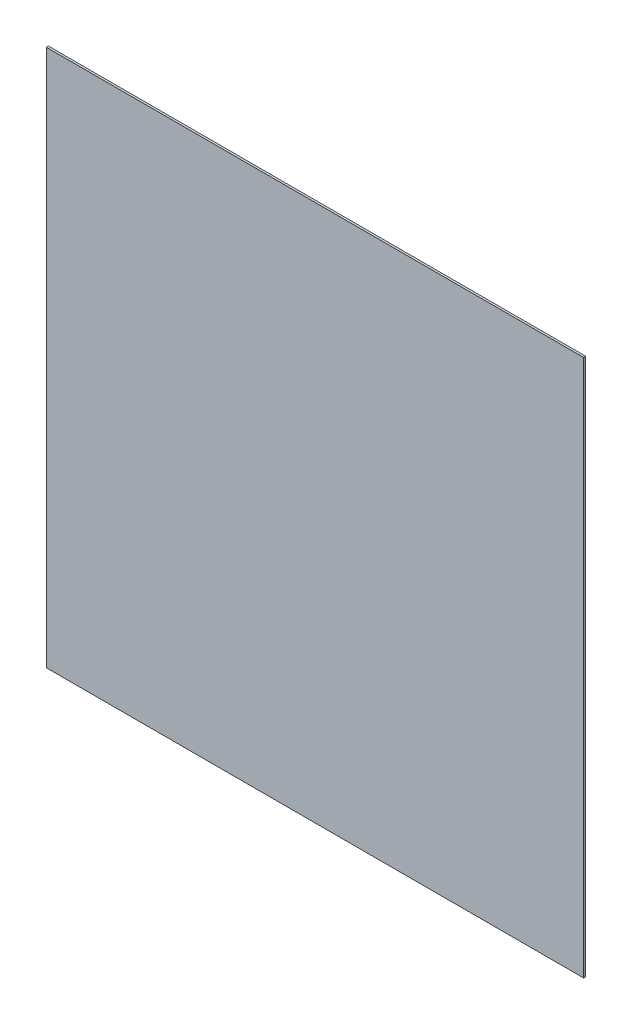
ISO-10303-21;
HEADER;
FILE_DESCRIPTION(('STEP AP214'),'2;1');
FILE_NAME('part.step','',(''),(''),'','','');
FILE_SCHEMA(('AUTOMOTIVE_DESIGN { 1 0 10303 214 1 1 1 1 }'));
ENDSEC;
DATA;
#1=APPLICATION_CONTEXT('core data for automotive mechanical design processes');
#2=APPLICATION_PROTOCOL_DEFINITION('international standard','automotive_design',2000,#1);
#3=PRODUCT_CONTEXT('',#1,'mechanical');
#4=PRODUCT('Part','Part','',(#3));
#5=PRODUCT_RELATED_PRODUCT_CATEGORY('part','',(#4));
#6=PRODUCT_DEFINITION_FORMATION('','',#4);
#7=PRODUCT_DEFINITION_CONTEXT('part definition',#1,'design');
#8=PRODUCT_DEFINITION('design','',#6,#7);
#9=PRODUCT_DEFINITION_SHAPE('','',#8);
#10=(LENGTH_UNIT() NAMED_UNIT(*) SI_UNIT(.MILLI.,.METRE.));
#11=(NAMED_UNIT(*) PLANE_ANGLE_UNIT() SI_UNIT($,.RADIAN.));
#12=(NAMED_UNIT(*) SI_UNIT($,.STERADIAN.) SOLID_ANGLE_UNIT());
#13=UNCERTAINTY_MEASURE_WITH_UNIT(LENGTH_MEASURE(1.E-05),#10,'distance_accuracy_value','');
#14=(GEOMETRIC_REPRESENTATION_CONTEXT(3) GLOBAL_UNCERTAINTY_ASSIGNED_CONTEXT((#13)) GLOBAL_UNIT_ASSIGNED_CONTEXT((#10,
#11,#12)) REPRESENTATION_CONTEXT('',''));
#15=CARTESIAN_POINT('',(0.,0.,0.));
#16=DIRECTION('',(0.,0.,1.));
#17=DIRECTION('',(1.,0.,0.));
#18=AXIS2_PLACEMENT_3D('',#15,#16,#17);
#19=CARTESIAN_POINT('',(25.4,125.4,0.39116));
#20=DIRECTION('',(1.,0.,0.));
#21=DIRECTION('',(0.,0.,-1.));
#22=AXIS2_PLACEMENT_3D('',#19,#20,#21);
#23=PLANE('',#22);
#24=DIRECTION('',(0.,-1.,0.));
#25=VECTOR('',#24,1.);
#26=CARTESIAN_POINT('',(25.4,125.4,0.));
#27=LINE('',#26,#25);
#28=CARTESIAN_POINT('',(25.4,125.4,0.));
#29=VERTEX_POINT('',#28);
#30=CARTESIAN_POINT('',(25.4,25.4,0.));
#31=VERTEX_POINT('',#30);
#32=EDGE_CURVE('E100',#29,#31,#27,.T.);
#33=ORIENTED_EDGE('',*,*,#32,.T.);
#34=DIRECTION('',(0.,0.,-1.));
#35=VECTOR('',#34,1.);
#36=CARTESIAN_POINT('',(25.4,25.4,0.39116));
#37=LINE('',#36,#35);
#38=CARTESIAN_POINT('',(25.4,25.4,0.39116));
#39=VERTEX_POINT('',#38);
#40=EDGE_CURVE('E11',#39,#31,#37,.T.);
#41=ORIENTED_EDGE('',*,*,#40,.F.);
#42=DIRECTION('',(0.,-1.,0.));
#43=VECTOR('',#42,1.);
#44=CARTESIAN_POINT('',(25.4,125.4,0.39116));
#45=LINE('',#44,#43);
#46=CARTESIAN_POINT('',(25.4,125.4,0.39116));
#47=VERTEX_POINT('',#46);
#48=EDGE_CURVE('E88',#47,#39,#45,.T.);
#49=ORIENTED_EDGE('',*,*,#48,.F.);
#50=DIRECTION('',(0.,0.,-1.));
#51=VECTOR('',#50,1.);
#52=CARTESIAN_POINT('',(25.4,125.4,0.39116));
#53=LINE('',#52,#51);
#54=EDGE_CURVE('E96',#47,#29,#53,.T.);
#55=ORIENTED_EDGE('',*,*,#54,.T.);
#56=EDGE_LOOP('',(#33,#41,#49,#55));
#57=FACE_BOUND('',#56,.T.);
#58=ADVANCED_FACE('F37',(#57),#23,.F.);
#59=CARTESIAN_POINT('',(25.4,25.4,0.39116));
#60=DIRECTION('',(0.,1.,0.));
#61=DIRECTION('',(0.,0.,1.));
#62=AXIS2_PLACEMENT_3D('',#59,#60,#61);
#63=PLANE('',#62);
#64=DIRECTION('',(1.,0.,0.));
#65=VECTOR('',#64,1.);
#66=CARTESIAN_POINT('',(25.4,25.4,0.));
#67=LINE('',#66,#65);
#68=CARTESIAN_POINT('',(125.4,25.4,0.));
#69=VERTEX_POINT('',#68);
#70=EDGE_CURVE('E92',#31,#69,#67,.T.);
#71=ORIENTED_EDGE('',*,*,#70,.T.);
#72=DIRECTION('',(0.,0.,-1.));
#73=VECTOR('',#72,1.);
#74=CARTESIAN_POINT('',(125.4,25.4,0.39116));
#75=LINE('',#74,#73);
#76=CARTESIAN_POINT('',(125.4,25.4,0.39116));
#77=VERTEX_POINT('',#76);
#78=EDGE_CURVE('E45',#77,#69,#75,.T.);
#79=ORIENTED_EDGE('',*,*,#78,.F.);
#80=DIRECTION('',(1.,0.,0.));
#81=VECTOR('',#80,1.);
#82=CARTESIAN_POINT('',(25.4,25.4,0.39116));
#83=LINE('',#82,#81);
#84=EDGE_CURVE('E83',#39,#77,#83,.T.);
#85=ORIENTED_EDGE('',*,*,#84,.F.);
#86=ORIENTED_EDGE('',*,*,#40,.T.);
#87=EDGE_LOOP('',(#71,#79,#85,#86));
#88=FACE_BOUND('',#87,.T.);
#89=ADVANCED_FACE('F91',(#88),#63,.F.);
#90=CARTESIAN_POINT('',(125.4,25.4,0.39116));
#91=DIRECTION('',(-1.,0.,0.));
#92=DIRECTION('',(0.,0.,1.));
#93=AXIS2_PLACEMENT_3D('',#90,#91,#92);
#94=PLANE('',#93);
#95=DIRECTION('',(0.,1.,0.));
#96=VECTOR('',#95,1.);
#97=CARTESIAN_POINT('',(125.4,25.4,0.));
#98=LINE('',#97,#96);
#99=CARTESIAN_POINT('',(125.4,125.4,0.));
#100=VERTEX_POINT('',#99);
#101=EDGE_CURVE('E70',#69,#100,#98,.T.);
#102=ORIENTED_EDGE('',*,*,#101,.T.);
#103=DIRECTION('',(0.,0.,-1.));
#104=VECTOR('',#103,1.);
#105=CARTESIAN_POINT('',(125.4,125.4,0.39116));
#106=LINE('',#105,#104);
#107=CARTESIAN_POINT('',(125.4,125.4,0.39116));
#108=VERTEX_POINT('',#107);
#109=EDGE_CURVE('E93',#108,#100,#106,.T.);
#110=ORIENTED_EDGE('',*,*,#109,.F.);
#111=DIRECTION('',(0.,1.,0.));
#112=VECTOR('',#111,1.);
#113=CARTESIAN_POINT('',(125.4,25.4,0.39116));
#114=LINE('',#113,#112);
#115=EDGE_CURVE('E86',#77,#108,#114,.T.);
#116=ORIENTED_EDGE('',*,*,#115,.F.);
#117=ORIENTED_EDGE('',*,*,#78,.T.);
#118=EDGE_LOOP('',(#102,#110,#116,#117));
#119=FACE_BOUND('',#118,.T.);
#120=ADVANCED_FACE('F94',(#119),#94,.F.);
#121=CARTESIAN_POINT('',(125.4,125.4,0.39116));
#122=DIRECTION('',(0.,-1.,0.));
#123=DIRECTION('',(0.,0.,-1.));
#124=AXIS2_PLACEMENT_3D('',#121,#122,#123);
#125=PLANE('',#124);
#126=DIRECTION('',(-1.,0.,0.));
#127=VECTOR('',#126,1.);
#128=CARTESIAN_POINT('',(125.4,125.4,0.));
#129=LINE('',#128,#127);
#130=EDGE_CURVE('E76',#100,#29,#129,.T.);
#131=ORIENTED_EDGE('',*,*,#130,.T.);
#132=ORIENTED_EDGE('',*,*,#54,.F.);
#133=DIRECTION('',(-1.,0.,0.));
#134=VECTOR('',#133,1.);
#135=CARTESIAN_POINT('',(125.4,125.4,0.39116));
#136=LINE('',#135,#134);
#137=EDGE_CURVE('E53',#108,#47,#136,.T.);
#138=ORIENTED_EDGE('',*,*,#137,.F.);
#139=ORIENTED_EDGE('',*,*,#109,.T.);
#140=EDGE_LOOP('',(#131,#132,#138,#139));
#141=FACE_BOUND('',#140,.T.);
#142=ADVANCED_FACE('F107',(#141),#125,.F.);
#143=CARTESIAN_POINT('',(0.,0.,0.39116));
#144=DIRECTION('',(0.,0.,1.));
#145=DIRECTION('',(1.,0.,0.));
#146=AXIS2_PLACEMENT_3D('',#143,#144,#145);
#147=PLANE('',#146);
#148=ORIENTED_EDGE('',*,*,#48,.T.);
#149=ORIENTED_EDGE('',*,*,#84,.T.);
#150=ORIENTED_EDGE('',*,*,#115,.T.);
#151=ORIENTED_EDGE('',*,*,#137,.T.);
#152=EDGE_LOOP('',(#148,#149,#150,#151));
#153=FACE_BOUND('',#152,.T.);
#154=ADVANCED_FACE('F84',(#153),#147,.T.);
#155=CARTESIAN_POINT('',(0.,0.,0.));
#156=DIRECTION('',(0.,0.,1.));
#157=DIRECTION('',(1.,0.,0.));
#158=AXIS2_PLACEMENT_3D('',#155,#156,#157);
#159=PLANE('',#158);
#160=ORIENTED_EDGE('',*,*,#32,.F.);
#161=ORIENTED_EDGE('',*,*,#130,.F.);
#162=ORIENTED_EDGE('',*,*,#101,.F.);
#163=ORIENTED_EDGE('',*,*,#70,.F.);
#164=EDGE_LOOP('',(#160,#161,#162,#163));
#165=FACE_BOUND('',#164,.T.);
#166=ADVANCED_FACE('F110',(#165),#159,.F.);
#167=CLOSED_SHELL('',(#58,#89,#120,#142,#154,#166));
#168=MANIFOLD_SOLID_BREP('B2',#167);
#169=ADVANCED_BREP_SHAPE_REPRESENTATION('',(#18,#168),#14);
#170=SHAPE_DEFINITION_REPRESENTATION(#9,#169);
ENDSEC;
END-ISO-10303-21;
